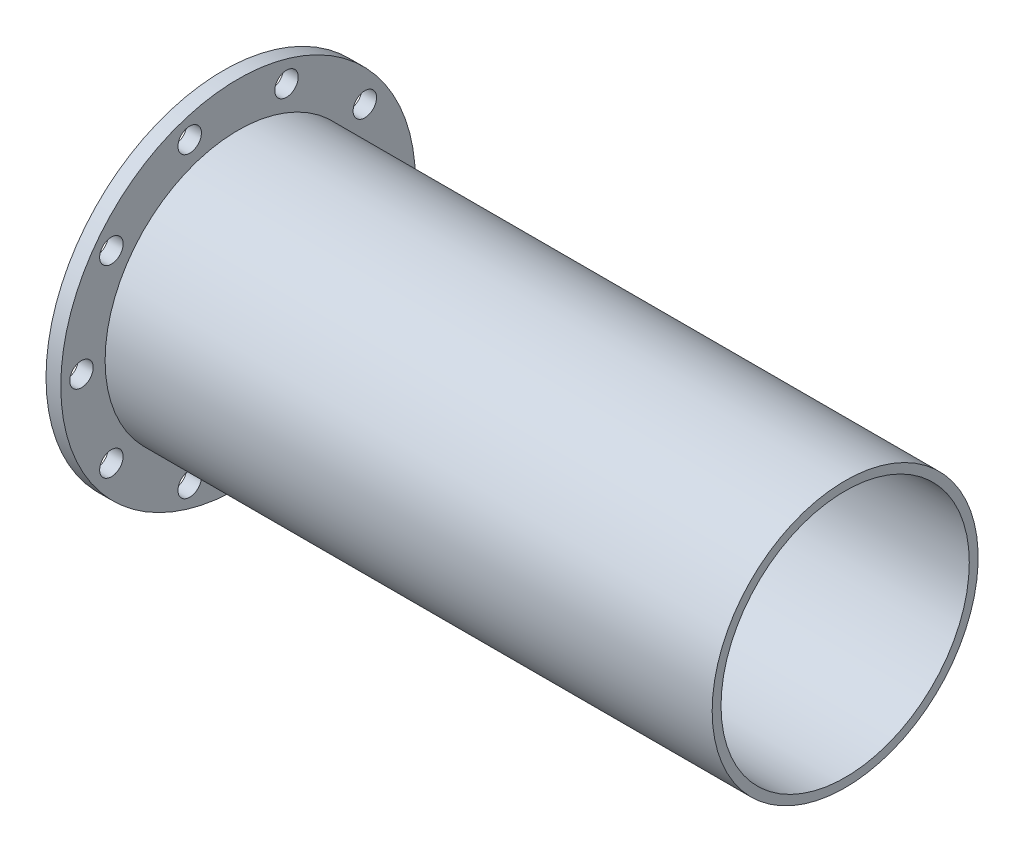
ISO-10303-21;
HEADER;
FILE_DESCRIPTION(('STEP AP214'),'2;1');
FILE_NAME('part.step','',(''),(''),'','','');
FILE_SCHEMA(('AUTOMOTIVE_DESIGN { 1 0 10303 214 1 1 1 1 }'));
ENDSEC;
DATA;
#1=APPLICATION_CONTEXT('core data for automotive mechanical design processes');
#2=APPLICATION_PROTOCOL_DEFINITION('international standard','automotive_design',2000,#1);
#3=PRODUCT_CONTEXT('',#1,'mechanical');
#4=PRODUCT('Part','Part','',(#3));
#5=PRODUCT_RELATED_PRODUCT_CATEGORY('part','',(#4));
#6=PRODUCT_DEFINITION_FORMATION('','',#4);
#7=PRODUCT_DEFINITION_CONTEXT('part definition',#1,'design');
#8=PRODUCT_DEFINITION('design','',#6,#7);
#9=PRODUCT_DEFINITION_SHAPE('','',#8);
#10=(LENGTH_UNIT() NAMED_UNIT(*) SI_UNIT(.MILLI.,.METRE.));
#11=(NAMED_UNIT(*) PLANE_ANGLE_UNIT() SI_UNIT($,.RADIAN.));
#12=(NAMED_UNIT(*) SI_UNIT($,.STERADIAN.) SOLID_ANGLE_UNIT());
#13=UNCERTAINTY_MEASURE_WITH_UNIT(LENGTH_MEASURE(1.E-05),#10,'distance_accuracy_value','');
#14=(GEOMETRIC_REPRESENTATION_CONTEXT(3) GLOBAL_UNCERTAINTY_ASSIGNED_CONTEXT((#13)) GLOBAL_UNIT_ASSIGNED_CONTEXT((#10,
#11,#12)) REPRESENTATION_CONTEXT('',''));
#15=CARTESIAN_POINT('',(0.,0.,0.));
#16=DIRECTION('',(0.,0.,1.));
#17=DIRECTION('',(1.,0.,0.));
#18=AXIS2_PLACEMENT_3D('',#15,#16,#17);
#19=CARTESIAN_POINT('',(0.,76.2,0.));
#20=DIRECTION('',(1.,0.,0.));
#21=DIRECTION('',(0.,0.,-1.));
#22=AXIS2_PLACEMENT_3D('',#19,#20,#21);
#23=PLANE('',#22);
#24=CARTESIAN_POINT('',(0.,39.5638253318057,-54.4549338913782));
#25=DIRECTION('',(1.,0.,0.));
#26=DIRECTION('',(0.,0.,-1.));
#27=AXIS2_PLACEMENT_3D('',#24,#25,#26);
#28=CIRCLE('',#27,5.04189999999997);
#29=CARTESIAN_POINT('',(0.,39.5638253318057,-59.4968338913782));
#30=VERTEX_POINT('',#29);
#31=EDGE_CURVE('E142',#30,#30,#28,.T.);
#32=ORIENTED_EDGE('',*,*,#31,.T.);
#33=EDGE_LOOP('',(#32));
#34=FACE_BOUND('',#33,.T.);
#35=CARTESIAN_POINT('',(0.,64.0156141118266,-20.7999338913784));
#36=DIRECTION('',(1.,0.,0.));
#37=DIRECTION('',(0.,0.,-1.));
#38=AXIS2_PLACEMENT_3D('',#35,#36,#37);
#39=CIRCLE('',#38,5.04189999999996);
#40=CARTESIAN_POINT('',(0.,64.0156141118266,-25.8418338913784));
#41=VERTEX_POINT('',#40);
#42=EDGE_CURVE('E134',#41,#41,#39,.T.);
#43=ORIENTED_EDGE('',*,*,#42,.T.);
#44=EDGE_LOOP('',(#43));
#45=FACE_BOUND('',#44,.T.);
#46=CARTESIAN_POINT('',(0.,64.015614111827,20.7999338913771));
#47=DIRECTION('',(1.,0.,0.));
#48=DIRECTION('',(0.,0.,-1.));
#49=AXIS2_PLACEMENT_3D('',#46,#47,#48);
#50=CIRCLE('',#49,5.04189999999996);
#51=CARTESIAN_POINT('',(0.,64.015614111827,15.7580338913771));
#52=VERTEX_POINT('',#51);
#53=EDGE_CURVE('E126',#52,#52,#50,.T.);
#54=ORIENTED_EDGE('',*,*,#53,.T.);
#55=EDGE_LOOP('',(#54));
#56=FACE_BOUND('',#55,.T.);
#57=CARTESIAN_POINT('',(0.,39.5638253318068,54.4549338913774));
#58=DIRECTION('',(1.,0.,0.));
#59=DIRECTION('',(0.,0.,-1.));
#60=AXIS2_PLACEMENT_3D('',#57,#58,#59);
#61=CIRCLE('',#60,5.04189999999997);
#62=CARTESIAN_POINT('',(0.,39.5638253318068,49.4130338913774));
#63=VERTEX_POINT('',#62);
#64=EDGE_CURVE('E118',#63,#63,#61,.T.);
#65=ORIENTED_EDGE('',*,*,#64,.T.);
#66=EDGE_LOOP('',(#65));
#67=FACE_BOUND('',#66,.T.);
#68=CARTESIAN_POINT('',(0.,0.,67.31));
#69=DIRECTION('',(1.,0.,0.));
#70=DIRECTION('',(0.,0.,-1.));
#71=AXIS2_PLACEMENT_3D('',#68,#69,#70);
#72=CIRCLE('',#71,5.04189999999997);
#73=CARTESIAN_POINT('',(0.,0.,62.2681));
#74=VERTEX_POINT('',#73);
#75=EDGE_CURVE('E110',#74,#74,#72,.T.);
#76=ORIENTED_EDGE('',*,*,#75,.T.);
#77=EDGE_LOOP('',(#76));
#78=FACE_BOUND('',#77,.T.);
#79=CARTESIAN_POINT('',(0.,-39.5638253318061,54.4549338913779));
#80=DIRECTION('',(1.,0.,0.));
#81=DIRECTION('',(0.,0.,-1.));
#82=AXIS2_PLACEMENT_3D('',#79,#80,#81);
#83=CIRCLE('',#82,5.04189999999997);
#84=CARTESIAN_POINT('',(0.,-39.5638253318061,49.413033891378));
#85=VERTEX_POINT('',#84);
#86=EDGE_CURVE('E102',#85,#85,#83,.T.);
#87=ORIENTED_EDGE('',*,*,#86,.T.);
#88=EDGE_LOOP('',(#87));
#89=FACE_BOUND('',#88,.T.);
#90=CARTESIAN_POINT('',(0.,-64.0156141118267,20.799933891378));
#91=DIRECTION('',(1.,0.,0.));
#92=DIRECTION('',(0.,0.,-1.));
#93=AXIS2_PLACEMENT_3D('',#90,#91,#92);
#94=CIRCLE('',#93,5.04189999999997);
#95=CARTESIAN_POINT('',(0.,-64.0156141118267,15.758033891378));
#96=VERTEX_POINT('',#95);
#97=EDGE_CURVE('E94',#96,#96,#94,.T.);
#98=ORIENTED_EDGE('',*,*,#97,.T.);
#99=EDGE_LOOP('',(#98));
#100=FACE_BOUND('',#99,.T.);
#101=CARTESIAN_POINT('',(0.,-64.0156141118268,-20.7999338913775));
#102=DIRECTION('',(1.,0.,0.));
#103=DIRECTION('',(0.,0.,-1.));
#104=AXIS2_PLACEMENT_3D('',#101,#102,#103);
#105=CIRCLE('',#104,5.04189999999997);
#106=CARTESIAN_POINT('',(0.,-64.0156141118268,-25.8418338913775));
#107=VERTEX_POINT('',#106);
#108=EDGE_CURVE('E86',#107,#107,#105,.T.);
#109=ORIENTED_EDGE('',*,*,#108,.T.);
#110=EDGE_LOOP('',(#109));
#111=FACE_BOUND('',#110,.T.);
#112=CARTESIAN_POINT('',(0.,-39.5638253318064,-54.4549338913777));
#113=DIRECTION('',(1.,0.,0.));
#114=DIRECTION('',(0.,0.,-1.));
#115=AXIS2_PLACEMENT_3D('',#112,#113,#114);
#116=CIRCLE('',#115,5.04189999999997);
#117=CARTESIAN_POINT('',(0.,-39.5638253318064,-59.4968338913776));
#118=VERTEX_POINT('',#117);
#119=EDGE_CURVE('E78',#118,#118,#116,.T.);
#120=ORIENTED_EDGE('',*,*,#119,.T.);
#121=EDGE_LOOP('',(#120));
#122=FACE_BOUND('',#121,.T.);
#123=CARTESIAN_POINT('',(0.,0.,-67.31));
#124=DIRECTION('',(1.,0.,0.));
#125=DIRECTION('',(0.,0.,-1.));
#126=AXIS2_PLACEMENT_3D('',#123,#124,#125);
#127=CIRCLE('',#126,5.04189999999997);
#128=CARTESIAN_POINT('',(0.,0.,-72.3519));
#129=VERTEX_POINT('',#128);
#130=EDGE_CURVE('E70',#129,#129,#127,.T.);
#131=ORIENTED_EDGE('',*,*,#130,.T.);
#132=EDGE_LOOP('',(#131));
#133=FACE_BOUND('',#132,.T.);
#134=CARTESIAN_POINT('',(0.,0.,0.));
#135=DIRECTION('',(-1.,0.,0.));
#136=DIRECTION('',(0.,0.,1.));
#137=AXIS2_PLACEMENT_3D('',#134,#135,#136);
#138=CIRCLE('',#137,53.34);
#139=CARTESIAN_POINT('',(0.,0.,53.34));
#140=VERTEX_POINT('',#139);
#141=EDGE_CURVE('E66',#140,#140,#138,.T.);
#142=ORIENTED_EDGE('',*,*,#141,.F.);
#143=EDGE_LOOP('',(#142));
#144=FACE_BOUND('',#143,.T.);
#145=CARTESIAN_POINT('',(0.,0.,0.));
#146=DIRECTION('',(-1.,0.,0.));
#147=DIRECTION('',(0.,0.,1.));
#148=AXIS2_PLACEMENT_3D('',#145,#146,#147);
#149=CIRCLE('',#148,76.2);
#150=CARTESIAN_POINT('',(0.,0.,76.2));
#151=VERTEX_POINT('',#150);
#152=EDGE_CURVE('E10',#151,#151,#149,.T.);
#153=ORIENTED_EDGE('',*,*,#152,.T.);
#154=EDGE_LOOP('',(#153));
#155=FACE_BOUND('',#154,.T.);
#156=ADVANCED_FACE('F39',(#34,#45,#56,#67,#78,#89,#100,#111,#122,#133,#144,#155),#23,.F.);
#157=CARTESIAN_POINT('',(0.,0.,0.));
#158=DIRECTION('',(-1.,0.,0.));
#159=DIRECTION('',(0.,0.,1.));
#160=AXIS2_PLACEMENT_3D('',#157,#158,#159);
#161=CYLINDRICAL_SURFACE('',#160,76.2);
#162=ORIENTED_EDGE('',*,*,#152,.F.);
#163=EDGE_LOOP('',(#162));
#164=FACE_BOUND('',#163,.T.);
#165=CARTESIAN_POINT('',(6.35000000000001,0.,0.));
#166=DIRECTION('',(-1.,0.,0.));
#167=DIRECTION('',(0.,0.,1.));
#168=AXIS2_PLACEMENT_3D('',#165,#166,#167);
#169=CIRCLE('',#168,76.2);
#170=CARTESIAN_POINT('',(6.35000000000001,0.,76.2));
#171=VERTEX_POINT('',#170);
#172=EDGE_CURVE('E46',#171,#171,#169,.T.);
#173=ORIENTED_EDGE('',*,*,#172,.T.);
#174=EDGE_LOOP('',(#173));
#175=FACE_BOUND('',#174,.T.);
#176=ADVANCED_FACE('F157',(#164,#175),#161,.T.);
#177=CARTESIAN_POINT('',(6.35,76.2,0.));
#178=DIRECTION('',(-1.,0.,0.));
#179=DIRECTION('',(0.,0.,1.));
#180=AXIS2_PLACEMENT_3D('',#177,#178,#179);
#181=PLANE('',#180);
#182=CARTESIAN_POINT('',(6.35,39.5638253318057,-54.4549338913782));
#183=DIRECTION('',(1.,0.,0.));
#184=DIRECTION('',(0.,0.,-1.));
#185=AXIS2_PLACEMENT_3D('',#182,#183,#184);
#186=CIRCLE('',#185,5.04189999999997);
#187=CARTESIAN_POINT('',(6.35,39.5638253318057,-59.4968338913782));
#188=VERTEX_POINT('',#187);
#189=EDGE_CURVE('E146',#188,#188,#186,.T.);
#190=ORIENTED_EDGE('',*,*,#189,.F.);
#191=EDGE_LOOP('',(#190));
#192=FACE_BOUND('',#191,.T.);
#193=CARTESIAN_POINT('',(6.35,64.0156141118266,-20.7999338913784));
#194=DIRECTION('',(1.,0.,0.));
#195=DIRECTION('',(0.,0.,-1.));
#196=AXIS2_PLACEMENT_3D('',#193,#194,#195);
#197=CIRCLE('',#196,5.04189999999996);
#198=CARTESIAN_POINT('',(6.35,64.0156141118266,-25.8418338913784));
#199=VERTEX_POINT('',#198);
#200=EDGE_CURVE('E138',#199,#199,#197,.T.);
#201=ORIENTED_EDGE('',*,*,#200,.F.);
#202=EDGE_LOOP('',(#201));
#203=FACE_BOUND('',#202,.T.);
#204=CARTESIAN_POINT('',(6.35,64.015614111827,20.7999338913771));
#205=DIRECTION('',(1.,0.,0.));
#206=DIRECTION('',(0.,0.,-1.));
#207=AXIS2_PLACEMENT_3D('',#204,#205,#206);
#208=CIRCLE('',#207,5.04189999999997);
#209=CARTESIAN_POINT('',(6.35,64.015614111827,15.7580338913771));
#210=VERTEX_POINT('',#209);
#211=EDGE_CURVE('E130',#210,#210,#208,.T.);
#212=ORIENTED_EDGE('',*,*,#211,.F.);
#213=EDGE_LOOP('',(#212));
#214=FACE_BOUND('',#213,.T.);
#215=CARTESIAN_POINT('',(6.35,39.5638253318068,54.4549338913774));
#216=DIRECTION('',(1.,0.,0.));
#217=DIRECTION('',(0.,0.,-1.));
#218=AXIS2_PLACEMENT_3D('',#215,#216,#217);
#219=CIRCLE('',#218,5.04189999999997);
#220=CARTESIAN_POINT('',(6.35,39.5638253318068,49.4130338913774));
#221=VERTEX_POINT('',#220);
#222=EDGE_CURVE('E122',#221,#221,#219,.T.);
#223=ORIENTED_EDGE('',*,*,#222,.F.);
#224=EDGE_LOOP('',(#223));
#225=FACE_BOUND('',#224,.T.);
#226=CARTESIAN_POINT('',(6.35,0.,67.31));
#227=DIRECTION('',(1.,0.,0.));
#228=DIRECTION('',(0.,0.,-1.));
#229=AXIS2_PLACEMENT_3D('',#226,#227,#228);
#230=CIRCLE('',#229,5.04189999999997);
#231=CARTESIAN_POINT('',(6.35,0.,62.2681));
#232=VERTEX_POINT('',#231);
#233=EDGE_CURVE('E114',#232,#232,#230,.T.);
#234=ORIENTED_EDGE('',*,*,#233,.F.);
#235=EDGE_LOOP('',(#234));
#236=FACE_BOUND('',#235,.T.);
#237=CARTESIAN_POINT('',(6.35,-39.5638253318061,54.4549338913779));
#238=DIRECTION('',(1.,0.,0.));
#239=DIRECTION('',(0.,0.,-1.));
#240=AXIS2_PLACEMENT_3D('',#237,#238,#239);
#241=CIRCLE('',#240,5.04189999999997);
#242=CARTESIAN_POINT('',(6.35,-39.5638253318061,49.413033891378));
#243=VERTEX_POINT('',#242);
#244=EDGE_CURVE('E106',#243,#243,#241,.T.);
#245=ORIENTED_EDGE('',*,*,#244,.F.);
#246=EDGE_LOOP('',(#245));
#247=FACE_BOUND('',#246,.T.);
#248=CARTESIAN_POINT('',(6.35,-64.0156141118267,20.799933891378));
#249=DIRECTION('',(1.,0.,0.));
#250=DIRECTION('',(0.,0.,-1.));
#251=AXIS2_PLACEMENT_3D('',#248,#249,#250);
#252=CIRCLE('',#251,5.04189999999997);
#253=CARTESIAN_POINT('',(6.35,-64.0156141118267,15.758033891378));
#254=VERTEX_POINT('',#253);
#255=EDGE_CURVE('E98',#254,#254,#252,.T.);
#256=ORIENTED_EDGE('',*,*,#255,.F.);
#257=EDGE_LOOP('',(#256));
#258=FACE_BOUND('',#257,.T.);
#259=CARTESIAN_POINT('',(6.35,-64.0156141118268,-20.7999338913775));
#260=DIRECTION('',(1.,0.,0.));
#261=DIRECTION('',(0.,0.,-1.));
#262=AXIS2_PLACEMENT_3D('',#259,#260,#261);
#263=CIRCLE('',#262,5.04189999999997);
#264=CARTESIAN_POINT('',(6.35,-64.0156141118268,-25.8418338913775));
#265=VERTEX_POINT('',#264);
#266=EDGE_CURVE('E90',#265,#265,#263,.T.);
#267=ORIENTED_EDGE('',*,*,#266,.F.);
#268=EDGE_LOOP('',(#267));
#269=FACE_BOUND('',#268,.T.);
#270=CARTESIAN_POINT('',(6.35,-39.5638253318064,-54.4549338913777));
#271=DIRECTION('',(1.,0.,0.));
#272=DIRECTION('',(0.,0.,-1.));
#273=AXIS2_PLACEMENT_3D('',#270,#271,#272);
#274=CIRCLE('',#273,5.04189999999997);
#275=CARTESIAN_POINT('',(6.35,-39.5638253318064,-59.4968338913776));
#276=VERTEX_POINT('',#275);
#277=EDGE_CURVE('E82',#276,#276,#274,.T.);
#278=ORIENTED_EDGE('',*,*,#277,.F.);
#279=EDGE_LOOP('',(#278));
#280=FACE_BOUND('',#279,.T.);
#281=CARTESIAN_POINT('',(6.35,0.,-67.31));
#282=DIRECTION('',(1.,0.,0.));
#283=DIRECTION('',(0.,0.,-1.));
#284=AXIS2_PLACEMENT_3D('',#281,#282,#283);
#285=CIRCLE('',#284,5.04189999999997);
#286=CARTESIAN_POINT('',(6.35,0.,-72.3519));
#287=VERTEX_POINT('',#286);
#288=EDGE_CURVE('E74',#287,#287,#285,.T.);
#289=ORIENTED_EDGE('',*,*,#288,.F.);
#290=EDGE_LOOP('',(#289));
#291=FACE_BOUND('',#290,.T.);
#292=ORIENTED_EDGE('',*,*,#172,.F.);
#293=EDGE_LOOP('',(#292));
#294=FACE_BOUND('',#293,.T.);
#295=CARTESIAN_POINT('',(6.35,0.,0.));
#296=DIRECTION('',(-1.,0.,0.));
#297=DIRECTION('',(0.,0.,1.));
#298=AXIS2_PLACEMENT_3D('',#295,#296,#297);
#299=CIRCLE('',#298,57.15);
#300=CARTESIAN_POINT('',(6.35,0.,57.15));
#301=VERTEX_POINT('',#300);
#302=EDGE_CURVE('E51',#301,#301,#299,.T.);
#303=ORIENTED_EDGE('',*,*,#302,.T.);
#304=EDGE_LOOP('',(#303));
#305=FACE_BOUND('',#304,.T.);
#306=ADVANCED_FACE('F153',(#192,#203,#214,#225,#236,#247,#258,#269,#280,#291,#294,#305),#181,.F.);
#307=CARTESIAN_POINT('',(0.,0.,0.));
#308=DIRECTION('',(-1.,0.,0.));
#309=DIRECTION('',(0.,0.,1.));
#310=AXIS2_PLACEMENT_3D('',#307,#308,#309);
#311=CYLINDRICAL_SURFACE('',#310,57.15);
#312=ORIENTED_EDGE('',*,*,#302,.F.);
#313=EDGE_LOOP('',(#312));
#314=FACE_BOUND('',#313,.T.);
#315=CARTESIAN_POINT('',(267.208,0.,0.));
#316=DIRECTION('',(-1.,0.,0.));
#317=DIRECTION('',(0.,0.,1.));
#318=AXIS2_PLACEMENT_3D('',#315,#316,#317);
#319=CIRCLE('',#318,57.15);
#320=CARTESIAN_POINT('',(267.208,0.,57.15));
#321=VERTEX_POINT('',#320);
#322=EDGE_CURVE('E56',#321,#321,#319,.T.);
#323=ORIENTED_EDGE('',*,*,#322,.T.);
#324=EDGE_LOOP('',(#323));
#325=FACE_BOUND('',#324,.T.);
#326=ADVANCED_FACE('F156',(#314,#325),#311,.T.);
#327=CARTESIAN_POINT('',(267.208,57.15,0.));
#328=DIRECTION('',(-1.,0.,0.));
#329=DIRECTION('',(0.,0.,1.));
#330=AXIS2_PLACEMENT_3D('',#327,#328,#329);
#331=PLANE('',#330);
#332=ORIENTED_EDGE('',*,*,#322,.F.);
#333=EDGE_LOOP('',(#332));
#334=FACE_BOUND('',#333,.T.);
#335=CARTESIAN_POINT('',(267.208,0.,0.));
#336=DIRECTION('',(-1.,0.,0.));
#337=DIRECTION('',(0.,0.,1.));
#338=AXIS2_PLACEMENT_3D('',#335,#336,#337);
#339=CIRCLE('',#338,53.34);
#340=CARTESIAN_POINT('',(267.208,0.,53.34));
#341=VERTEX_POINT('',#340);
#342=EDGE_CURVE('E62',#341,#341,#339,.T.);
#343=ORIENTED_EDGE('',*,*,#342,.T.);
#344=EDGE_LOOP('',(#343));
#345=FACE_BOUND('',#344,.T.);
#346=ADVANCED_FACE('F182',(#334,#345),#331,.F.);
#347=CARTESIAN_POINT('',(0.,0.,0.));
#348=DIRECTION('',(-1.,0.,0.));
#349=DIRECTION('',(0.,0.,1.));
#350=AXIS2_PLACEMENT_3D('',#347,#348,#349);
#351=CYLINDRICAL_SURFACE('',#350,53.34);
#352=ORIENTED_EDGE('',*,*,#342,.F.);
#353=EDGE_LOOP('',(#352));
#354=FACE_BOUND('',#353,.T.);
#355=ORIENTED_EDGE('',*,*,#141,.T.);
#356=EDGE_LOOP('',(#355));
#357=FACE_BOUND('',#356,.T.);
#358=ADVANCED_FACE('F188',(#354,#357),#351,.F.);
#359=CARTESIAN_POINT('',(6.35,0.,-67.31));
#360=DIRECTION('',(1.,0.,0.));
#361=DIRECTION('',(0.,0.,-1.));
#362=AXIS2_PLACEMENT_3D('',#359,#360,#361);
#363=CYLINDRICAL_SURFACE('',#362,5.04189999999997);
#364=ORIENTED_EDGE('',*,*,#130,.F.);
#365=EDGE_LOOP('',(#364));
#366=FACE_BOUND('',#365,.T.);
#367=ORIENTED_EDGE('',*,*,#288,.T.);
#368=EDGE_LOOP('',(#367));
#369=FACE_BOUND('',#368,.T.);
#370=ADVANCED_FACE('F194',(#366,#369),#363,.F.);
#371=CARTESIAN_POINT('',(6.35,-39.5638253318064,-54.4549338913777));
#372=DIRECTION('',(1.,0.,0.));
#373=DIRECTION('',(0.,0.,-1.));
#374=AXIS2_PLACEMENT_3D('',#371,#372,#373);
#375=CYLINDRICAL_SURFACE('',#374,5.04189999999997);
#376=ORIENTED_EDGE('',*,*,#119,.F.);
#377=EDGE_LOOP('',(#376));
#378=FACE_BOUND('',#377,.T.);
#379=ORIENTED_EDGE('',*,*,#277,.T.);
#380=EDGE_LOOP('',(#379));
#381=FACE_BOUND('',#380,.T.);
#382=ADVANCED_FACE('F226',(#378,#381),#375,.F.);
#383=CARTESIAN_POINT('',(6.35,-64.0156141118268,-20.7999338913775));
#384=DIRECTION('',(1.,0.,0.));
#385=DIRECTION('',(0.,0.,-1.));
#386=AXIS2_PLACEMENT_3D('',#383,#384,#385);
#387=CYLINDRICAL_SURFACE('',#386,5.04189999999997);
#388=ORIENTED_EDGE('',*,*,#108,.F.);
#389=EDGE_LOOP('',(#388));
#390=FACE_BOUND('',#389,.T.);
#391=ORIENTED_EDGE('',*,*,#266,.T.);
#392=EDGE_LOOP('',(#391));
#393=FACE_BOUND('',#392,.T.);
#394=ADVANCED_FACE('F231',(#390,#393),#387,.F.);
#395=CARTESIAN_POINT('',(6.35,-64.0156141118267,20.799933891378));
#396=DIRECTION('',(1.,0.,0.));
#397=DIRECTION('',(0.,0.,-1.));
#398=AXIS2_PLACEMENT_3D('',#395,#396,#397);
#399=CYLINDRICAL_SURFACE('',#398,5.04189999999997);
#400=ORIENTED_EDGE('',*,*,#97,.F.);
#401=EDGE_LOOP('',(#400));
#402=FACE_BOUND('',#401,.T.);
#403=ORIENTED_EDGE('',*,*,#255,.T.);
#404=EDGE_LOOP('',(#403));
#405=FACE_BOUND('',#404,.T.);
#406=ADVANCED_FACE('F237',(#402,#405),#399,.F.);
#407=CARTESIAN_POINT('',(6.35,-39.5638253318061,54.4549338913779));
#408=DIRECTION('',(1.,0.,0.));
#409=DIRECTION('',(0.,0.,-1.));
#410=AXIS2_PLACEMENT_3D('',#407,#408,#409);
#411=CYLINDRICAL_SURFACE('',#410,5.04189999999997);
#412=ORIENTED_EDGE('',*,*,#86,.F.);
#413=EDGE_LOOP('',(#412));
#414=FACE_BOUND('',#413,.T.);
#415=ORIENTED_EDGE('',*,*,#244,.T.);
#416=EDGE_LOOP('',(#415));
#417=FACE_BOUND('',#416,.T.);
#418=ADVANCED_FACE('F241',(#414,#417),#411,.F.);
#419=CARTESIAN_POINT('',(6.35,0.,67.31));
#420=DIRECTION('',(1.,0.,0.));
#421=DIRECTION('',(0.,0.,-1.));
#422=AXIS2_PLACEMENT_3D('',#419,#420,#421);
#423=CYLINDRICAL_SURFACE('',#422,5.04189999999997);
#424=ORIENTED_EDGE('',*,*,#75,.F.);
#425=EDGE_LOOP('',(#424));
#426=FACE_BOUND('',#425,.T.);
#427=ORIENTED_EDGE('',*,*,#233,.T.);
#428=EDGE_LOOP('',(#427));
#429=FACE_BOUND('',#428,.T.);
#430=ADVANCED_FACE('F245',(#426,#429),#423,.F.);
#431=CARTESIAN_POINT('',(6.35,39.5638253318068,54.4549338913774));
#432=DIRECTION('',(1.,0.,0.));
#433=DIRECTION('',(0.,0.,-1.));
#434=AXIS2_PLACEMENT_3D('',#431,#432,#433);
#435=CYLINDRICAL_SURFACE('',#434,5.04189999999997);
#436=ORIENTED_EDGE('',*,*,#64,.F.);
#437=EDGE_LOOP('',(#436));
#438=FACE_BOUND('',#437,.T.);
#439=ORIENTED_EDGE('',*,*,#222,.T.);
#440=EDGE_LOOP('',(#439));
#441=FACE_BOUND('',#440,.T.);
#442=ADVANCED_FACE('F249',(#438,#441),#435,.F.);
#443=CARTESIAN_POINT('',(6.35,64.015614111827,20.7999338913771));
#444=DIRECTION('',(1.,0.,0.));
#445=DIRECTION('',(0.,0.,-1.));
#446=AXIS2_PLACEMENT_3D('',#443,#444,#445);
#447=CYLINDRICAL_SURFACE('',#446,5.04189999999997);
#448=ORIENTED_EDGE('',*,*,#53,.F.);
#449=EDGE_LOOP('',(#448));
#450=FACE_BOUND('',#449,.T.);
#451=ORIENTED_EDGE('',*,*,#211,.T.);
#452=EDGE_LOOP('',(#451));
#453=FACE_BOUND('',#452,.T.);
#454=ADVANCED_FACE('F253',(#450,#453),#447,.F.);
#455=CARTESIAN_POINT('',(6.35,64.0156141118266,-20.7999338913784));
#456=DIRECTION('',(1.,0.,0.));
#457=DIRECTION('',(0.,0.,-1.));
#458=AXIS2_PLACEMENT_3D('',#455,#456,#457);
#459=CYLINDRICAL_SURFACE('',#458,5.04189999999996);
#460=ORIENTED_EDGE('',*,*,#42,.F.);
#461=EDGE_LOOP('',(#460));
#462=FACE_BOUND('',#461,.T.);
#463=ORIENTED_EDGE('',*,*,#200,.T.);
#464=EDGE_LOOP('',(#463));
#465=FACE_BOUND('',#464,.T.);
#466=ADVANCED_FACE('F257',(#462,#465),#459,.F.);
#467=CARTESIAN_POINT('',(6.35,39.5638253318057,-54.4549338913782));
#468=DIRECTION('',(1.,0.,0.));
#469=DIRECTION('',(0.,0.,-1.));
#470=AXIS2_PLACEMENT_3D('',#467,#468,#469);
#471=CYLINDRICAL_SURFACE('',#470,5.04189999999997);
#472=ORIENTED_EDGE('',*,*,#31,.F.);
#473=EDGE_LOOP('',(#472));
#474=FACE_BOUND('',#473,.T.);
#475=ORIENTED_EDGE('',*,*,#189,.T.);
#476=EDGE_LOOP('',(#475));
#477=FACE_BOUND('',#476,.T.);
#478=ADVANCED_FACE('F151',(#474,#477),#471,.F.);
#479=CLOSED_SHELL('',(#156,#176,#306,#326,#346,#358,#370,#382,#394,#406,#418,#430,#442,#454,
#466,#478));
#480=MANIFOLD_SOLID_BREP('B2',#479);
#481=ADVANCED_BREP_SHAPE_REPRESENTATION('',(#18,#480),#14);
#482=SHAPE_DEFINITION_REPRESENTATION(#9,#481);
ENDSEC;
END-ISO-10303-21;
